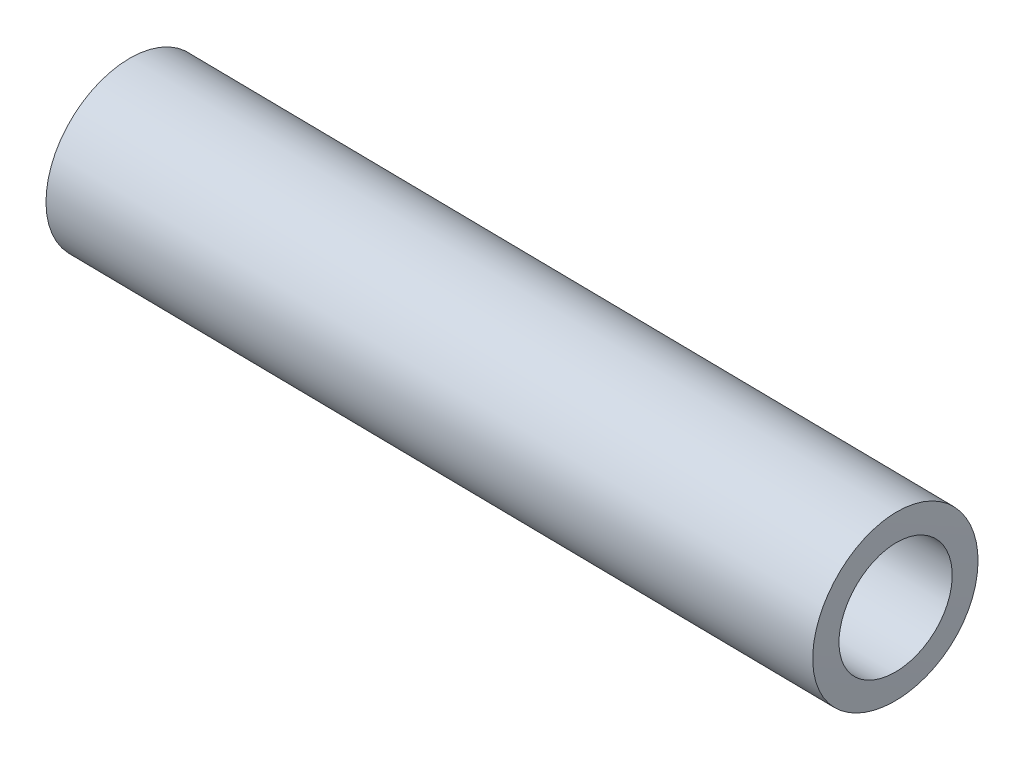
ISO-10303-21;
HEADER;
FILE_DESCRIPTION(('STEP AP214'),'2;1');
FILE_NAME('part.step','',(''),(''),'','','');
FILE_SCHEMA(('AUTOMOTIVE_DESIGN { 1 0 10303 214 1 1 1 1 }'));
ENDSEC;
DATA;
#1=APPLICATION_CONTEXT('core data for automotive mechanical design processes');
#2=APPLICATION_PROTOCOL_DEFINITION('international standard','automotive_design',2000,#1);
#3=PRODUCT_CONTEXT('',#1,'mechanical');
#4=PRODUCT('Part','Part','',(#3));
#5=PRODUCT_RELATED_PRODUCT_CATEGORY('part','',(#4));
#6=PRODUCT_DEFINITION_FORMATION('','',#4);
#7=PRODUCT_DEFINITION_CONTEXT('part definition',#1,'design');
#8=PRODUCT_DEFINITION('design','',#6,#7);
#9=PRODUCT_DEFINITION_SHAPE('','',#8);
#10=(LENGTH_UNIT() NAMED_UNIT(*) SI_UNIT(.MILLI.,.METRE.));
#11=(NAMED_UNIT(*) PLANE_ANGLE_UNIT() SI_UNIT($,.RADIAN.));
#12=(NAMED_UNIT(*) SI_UNIT($,.STERADIAN.) SOLID_ANGLE_UNIT());
#13=UNCERTAINTY_MEASURE_WITH_UNIT(LENGTH_MEASURE(1.E-05),#10,'distance_accuracy_value','');
#14=(GEOMETRIC_REPRESENTATION_CONTEXT(3) GLOBAL_UNCERTAINTY_ASSIGNED_CONTEXT((#13)) GLOBAL_UNIT_ASSIGNED_CONTEXT((#10,
#11,#12)) REPRESENTATION_CONTEXT('',''));
#15=CARTESIAN_POINT('',(0.,0.,0.));
#16=DIRECTION('',(0.,0.,1.));
#17=DIRECTION('',(1.,0.,0.));
#18=AXIS2_PLACEMENT_3D('',#15,#16,#17);
#19=CARTESIAN_POINT('',(0.,0.,0.));
#20=DIRECTION('',(0.999904802462717,-0.0137980437741954,0.));
#21=DIRECTION('',(0.0137980437741954,0.999904802462717,0.));
#22=AXIS2_PLACEMENT_3D('',#19,#20,#21);
#23=PLANE('',#22);
#24=CARTESIAN_POINT('',(0.,0.,0.));
#25=DIRECTION('',(0.999904802462717,-0.0137980437741954,0.));
#26=DIRECTION('',(0.0137980437741954,0.999904802462717,0.));
#27=AXIS2_PLACEMENT_3D('',#24,#25,#26);
#28=CIRCLE('',#27,2.175);
#29=CARTESIAN_POINT('',(0.0300107452088749,2.17479294535641,0.));
#30=VERTEX_POINT('',#29);
#31=EDGE_CURVE('E45',#30,#30,#28,.T.);
#32=ORIENTED_EDGE('',*,*,#31,.T.);
#33=EDGE_LOOP('',(#32));
#34=FACE_BOUND('',#33,.T.);
#35=CARTESIAN_POINT('',(0.,0.,0.));
#36=DIRECTION('',(0.999904802462717,-0.0137980437741954,0.));
#37=DIRECTION('',(0.0137980437741954,0.999904802462717,0.));
#38=AXIS2_PLACEMENT_3D('',#35,#36,#37);
#39=CIRCLE('',#38,3.175);
#40=CARTESIAN_POINT('',(0.0438087889830703,3.17469774781913,0.));
#41=VERTEX_POINT('',#40);
#42=EDGE_CURVE('E11',#41,#41,#39,.T.);
#43=ORIENTED_EDGE('',*,*,#42,.F.);
#44=EDGE_LOOP('',(#43));
#45=FACE_BOUND('',#44,.T.);
#46=ADVANCED_FACE('F39',(#34,#45),#23,.F.);
#47=CARTESIAN_POINT('',(0.,0.,0.));
#48=DIRECTION('',(0.999904802462717,-0.0137980437741953,0.));
#49=DIRECTION('',(0.0137980437741953,0.999904802462717,0.));
#50=AXIS2_PLACEMENT_3D('',#47,#48,#49);
#51=CYLINDRICAL_SURFACE('',#50,3.175);
#52=ORIENTED_EDGE('',*,*,#42,.T.);
#53=EDGE_LOOP('',(#52));
#54=FACE_BOUND('',#53,.T.);
#55=CARTESIAN_POINT('',(29.3785921963728,-3.5807079757313,0.));
#56=CARTESIAN_POINT('',(29.3752590480493,-3.5806541653769,0.178212508493683));
#57=CARTESIAN_POINT('',(29.3724845661729,-3.5655677856422,0.356558065686487));
#58=CARTESIAN_POINT('',(29.3683887993147,-3.50568321701444,0.708355102797621));
#59=CARTESIAN_POINT('',(29.3670692223117,-3.46085020584552,0.881800598168999));
#60=CARTESIAN_POINT('',(29.3660887109908,-3.34274287958135,1.21865930768428));
#61=CARTESIAN_POINT('',(29.3664270482651,-3.26948106775759,1.38207689566006));
#62=CARTESIAN_POINT('',(29.3688082859725,-3.09661416907263,1.69425732874237));
#63=CARTESIAN_POINT('',(29.3708507711606,-2.99701550367882,1.84302373399065));
#64=CARTESIAN_POINT('',(29.376524253009,-2.77432963855038,2.12168899112097));
#65=CARTESIAN_POINT('',(29.3801547941635,-2.6512491798576,2.25159323905932));
#66=CARTESIAN_POINT('',(29.3887383169265,-2.3850686278448,2.48890884426197));
#67=CARTESIAN_POINT('',(29.3936913538519,-2.24196769723202,2.59631926032374));
#68=CARTESIAN_POINT('',(29.4045309193483,-1.93972912910915,2.78565170799855));
#69=CARTESIAN_POINT('',(29.4104179069899,-1.78058361920398,2.86756114599454));
#70=CARTESIAN_POINT('',(29.4226457110972,-1.4508182903012,3.0035055475599));
#71=CARTESIAN_POINT('',(29.4289865291313,-1.28019843164891,3.0575404147908));
#72=CARTESIAN_POINT('',(29.4416118421916,-0.932167833560261,3.13623885405601));
#73=CARTESIAN_POINT('',(29.4478962881096,-0.754751771430641,3.16087889815372));
#74=CARTESIAN_POINT('',(29.4599020105504,-0.398282709157667,3.18000618199061));
#75=CARTESIAN_POINT('',(29.4656232887192,-0.219229713800028,3.17449350985573));
#76=CARTESIAN_POINT('',(29.4760653562866,0.135407346462868,3.13346811979988));
#77=CARTESIAN_POINT('',(29.4807863049548,0.310991959551009,3.09796018213402));
#78=CARTESIAN_POINT('',(29.4889008645109,0.653733113931407,2.99795243852028));
#79=CARTESIAN_POINT('',(29.4922944819223,0.8208896966412,2.93345277506072));
#80=CARTESIAN_POINT('',(29.4975638620792,1.14188044062916,2.7773608845751));
#81=CARTESIAN_POINT('',(29.4994409385308,1.29572602918502,2.68579220027026));
#82=CARTESIAN_POINT('',(29.5016495747917,1.5858873330509,2.47814360887074));
#83=CARTESIAN_POINT('',(29.5019811374282,1.72220308042833,2.36206374661546));
#84=CARTESIAN_POINT('',(29.5012199667841,1.97340894602012,2.10872043116794));
#85=CARTESIAN_POINT('',(29.5001275489637,2.08830380324814,1.97146167576144));
#86=CARTESIAN_POINT('',(29.4967753385494,2.29345294958376,1.67963561025278));
#87=CARTESIAN_POINT('',(29.4945155396551,2.3837071056987,1.52506820673742));
#88=CARTESIAN_POINT('',(29.4891853894652,2.53708078288938,1.20287785839574));
#89=CARTESIAN_POINT('',(29.4861144163864,2.60017939065132,1.03524496836199));
#90=CARTESIAN_POINT('',(29.4795818220167,2.69735217351047,0.691774718601178));
#91=CARTESIAN_POINT('',(29.4761201992581,2.73142623954609,0.515937328047792));
#92=CARTESIAN_POINT('',(29.4692338711295,2.76958835557505,0.160936537255392));
#93=CARTESIAN_POINT('',(29.4658091875864,2.77365955301386,-0.0182286755855951));
#94=CARTESIAN_POINT('',(29.4593899766723,2.75164509027163,-0.374704685658184));
#95=CARTESIAN_POINT('',(29.4563954477476,2.7255595390196,-0.55201548958575));
#96=CARTESIAN_POINT('',(29.4511458195568,2.64398387858084,-0.899652802161454));
#97=CARTESIAN_POINT('',(29.4488903347784,2.5885091395112,-1.06998291149226));
#98=CARTESIAN_POINT('',(29.4453067776066,2.44973467080098,-1.3989135658282));
#99=CARTESIAN_POINT('',(29.4439787000961,2.36643509469434,-1.55751417554936));
#100=CARTESIAN_POINT('',(29.4423034786049,2.17445572059152,-1.85835599514252));
#101=CARTESIAN_POINT('',(29.4419555584009,2.06579608007489,-2.00061006475905));
#102=CARTESIAN_POINT('',(29.4421510261388,1.8261494560991,-2.26486935634854));
#103=CARTESIAN_POINT('',(29.442694415578,1.69516243513384,-2.38687454430622));
#104=CARTESIAN_POINT('',(29.4444588496681,1.41455778058497,-2.60720143542545));
#105=CARTESIAN_POINT('',(29.4456800134251,1.2649368760289,-2.70551897156737));
#106=CARTESIAN_POINT('',(29.4484884094659,0.951326951650522,-2.87566501285506));
#107=CARTESIAN_POINT('',(29.450075643538,0.78733786163841,-2.9474933885901));
#108=CARTESIAN_POINT('',(29.4532483342847,0.449489401271856,-3.06268240461309));
#109=CARTESIAN_POINT('',(29.4548337882182,0.275621581846951,-3.10601826521746));
#110=CARTESIAN_POINT('',(29.4576206337842,-0.0769248268427774,-3.16289372693102));
#111=CARTESIAN_POINT('',(29.4588220242146,-0.255603431164911,-3.17643323476941));
#112=CARTESIAN_POINT('',(29.4604977219128,-0.612738977395154,-3.17332606736118));
#113=CARTESIAN_POINT('',(29.4609718800864,-0.791195866356886,-3.15667320372464));
#114=CARTESIAN_POINT('',(29.4609314629082,-1.1427787163772,-3.09363434150447));
#115=CARTESIAN_POINT('',(29.4604168909468,-1.3159046957141,-3.04724844487972));
#116=CARTESIAN_POINT('',(29.4582563442031,-1.65177104539978,-2.92610304109604));
#117=CARTESIAN_POINT('',(29.4566112278417,-1.81451919323355,-2.85136508089427));
#118=CARTESIAN_POINT('',(29.4521867181082,-2.12513999867619,-2.67563777248148));
#119=CARTESIAN_POINT('',(29.4494073724954,-2.27301328229582,-2.5746495296589));
#120=CARTESIAN_POINT('',(29.4428578088769,-2.54960179314022,-2.34936766015685));
#121=CARTESIAN_POINT('',(29.439088236391,-2.67832941593397,-2.22508923120465));
#122=CARTESIAN_POINT('',(29.4308307575864,-2.91312884107981,-1.95667303372886));
#123=CARTESIAN_POINT('',(29.4263426738715,-3.01919503332305,-1.8125303620688));
#124=CARTESIAN_POINT('',(29.4170261263272,-3.20572786666503,-1.5083658043606));
#125=CARTESIAN_POINT('',(29.4121973254625,-3.28616871310809,-1.34832812946173));
#126=CARTESIAN_POINT('',(29.4026575488194,-3.41896509456258,-1.01714372832326));
#127=CARTESIAN_POINT('',(29.3979464413136,-3.47135350559268,-0.846010270751458));
#128=CARTESIAN_POINT('',(29.3907317235721,-3.5328643557611,-0.561519313805369));
#129=CARTESIAN_POINT('',(29.3880522768198,-3.55080841735575,-0.449995928430688));
#130=CARTESIAN_POINT('',(29.383037933621,-3.57474727260559,-0.225666149504658));
#131=CARTESIAN_POINT('',(29.3807030375524,-3.58074205315629,-0.1128597545464));
#132=CARTESIAN_POINT('',(29.3785921963728,-3.5807079757313,0.));
#133=B_SPLINE_CURVE_WITH_KNOTS('',3,(#55,#56,#57,#58,#59,#60,#61,#62,#63,#64,#65,#66,#67,#68,
#69,#70,#71,#72,#73,#74,#75,#76,#77,#78,#79,#80,#81,#82,#83,#84,#85,#86,#87,#88,#89,#90,#91,#92,
#93,#94,#95,#96,#97,#98,#99,#100,#101,#102,#103,#104,#105,#106,#107,#108,#109,#110,#111,#112,
#113,#114,#115,#116,#117,#118,#119,#120,#121,#122,#123,#124,#125,#126,#127,#128,#129,#130,#131,
#132),.UNSPECIFIED.,.T.,.F.,(4,2,2,2,2,2,2,2,2,2,2,2,2,2,2,2,2,2,2,2,2,2,2,2,2,2,2,2,2,2,2,2,2,
2,2,2,2,2,4),(0.,0.534319751264771,1.06926609902135,1.60397743818695,2.13855852373435,
2.67298637457333,3.20743658284771,3.74215031135705,4.2768658879006,4.81200917007237,
5.34715088820659,5.88220733850277,6.41726115913596,6.95185099006359,7.48643984305019,
8.02091028648869,8.55538361455448,9.09026782340098,9.62515404210062,10.1603406824943,
10.6955253897498,11.2304304791058,11.7653326169716,12.299811026528,12.8342903339236,
13.3688635958509,13.9034394693594,14.4384796458659,14.9735214971932,15.5086730259573,
16.0438227196194,16.5785665231841,17.1132878125571,17.6476613834166,18.1821670919672,
18.7172091499975,19.2516227860834,19.5900004361923,19.9283784573915),.UNSPECIFIED.);
#134=CARTESIAN_POINT('',(29.3785921963728,-3.5807079757313,0.));
#135=VERTEX_POINT('',#134);
#136=EDGE_CURVE('E53',#135,#135,#133,.T.);
#137=ORIENTED_EDGE('',*,*,#136,.T.);
#138=EDGE_LOOP('',(#137));
#139=FACE_BOUND('',#138,.T.);
#140=ADVANCED_FACE('F74',(#54,#139),#51,.T.);
#141=CARTESIAN_POINT('',(0.,0.,0.));
#142=DIRECTION('',(0.999904802462717,-0.0137980437741953,0.));
#143=DIRECTION('',(0.0137980437741953,0.999904802462717,0.));
#144=AXIS2_PLACEMENT_3D('',#141,#142,#143);
#145=CYLINDRICAL_SURFACE('',#144,2.175);
#146=ORIENTED_EDGE('',*,*,#31,.F.);
#147=EDGE_LOOP('',(#146));
#148=FACE_BOUND('',#147,.T.);
#149=CARTESIAN_POINT('',(29.4208274621546,-2.58119558865964,0.));
#150=CARTESIAN_POINT('',(29.419263329916,-2.58116861647864,0.122129360231471));
#151=CARTESIAN_POINT('',(29.418006391571,-2.57083469936935,0.244348506529332));
#152=CARTESIAN_POINT('',(29.416263430287,-2.52979669121451,0.485426495211247));
#153=CARTESIAN_POINT('',(29.4157783261439,-2.49906838411098,0.604281167520492));
#154=CARTESIAN_POINT('',(29.415671530385,-2.41811484173385,0.835105712912034));
#155=CARTESIAN_POINT('',(29.416049442153,-2.36789857134687,0.947078724311936));
#156=CARTESIAN_POINT('',(29.4176838201298,-2.24940737879853,1.16097651329309));
#157=CARTESIAN_POINT('',(29.4189400700245,-2.18113690553483,1.2629037578594));
#158=CARTESIAN_POINT('',(29.4222684845585,-2.02847665832366,1.45384465334013));
#159=CARTESIAN_POINT('',(29.4243405848559,-1.94408815579034,1.54285932184395));
#160=CARTESIAN_POINT('',(29.4291654154392,-1.76157946614712,1.70546258066839));
#161=CARTESIAN_POINT('',(29.4319181732677,-1.6634587234355,1.77905054652884));
#162=CARTESIAN_POINT('',(29.4379088810119,-1.45624730544814,1.90872582744952));
#163=CARTESIAN_POINT('',(29.441146938336,-1.34715420348603,1.96480925984094));
#164=CARTESIAN_POINT('',(29.4478698661671,-1.12110797443002,2.05786471678806));
#165=CARTESIAN_POINT('',(29.451354736811,-1.00415484297389,2.09483673073702));
#166=CARTESIAN_POINT('',(29.4583161238711,-0.765656183801529,2.14863183639577));
#167=CARTESIAN_POINT('',(29.4617926366531,-0.644108945748158,2.16544734629922));
#168=CARTESIAN_POINT('',(29.4684856157513,-0.399909828331075,2.17842567493382));
#169=CARTESIAN_POINT('',(29.4717020826741,-0.27725795154498,2.17458854184438));
#170=CARTESIAN_POINT('',(29.4776549312101,-0.0343380817565879,2.14636936715249));
#171=CARTESIAN_POINT('',(29.4803913488938,0.085930089752466,2.12198886996083));
#172=CARTESIAN_POINT('',(29.4852158533804,0.320677097129612,2.05337511513746));
#173=CARTESIAN_POINT('',(29.4873039413146,0.435155943099679,2.00914189214872));
#174=CARTESIAN_POINT('',(29.4907288729423,0.655026679457501,1.90210035177872));
#175=CARTESIAN_POINT('',(29.4920660223103,0.7604222524417,1.83929960834546));
#176=CARTESIAN_POINT('',(29.4939623067928,0.959185922382892,1.69689995139603));
#177=CARTESIAN_POINT('',(29.4945214427399,1.052554032211,1.61730105585655));
#178=CARTESIAN_POINT('',(29.4949072908668,1.22460375863754,1.4435750424449));
#179=CARTESIAN_POINT('',(29.4947340786198,1.30328688974783,1.34944942459434));
#180=CARTESIAN_POINT('',(29.4937664101551,1.44374751932507,1.14933507669506));
#181=CARTESIAN_POINT('',(29.4929719523139,1.50552497360974,1.04334631564351));
#182=CARTESIAN_POINT('',(29.4909226946925,1.61044182655082,0.822470961713802));
#183=CARTESIAN_POINT('',(29.4896677286218,1.65357448026473,0.707581166492262));
#184=CARTESIAN_POINT('',(29.4868890550951,1.71994487230262,0.472194957616573));
#185=CARTESIAN_POINT('',(29.4853653471747,1.74318257624716,0.351698534274278));
#186=CARTESIAN_POINT('',(29.4822475051574,1.7691045154953,0.108483383859914));
#187=CARTESIAN_POINT('',(29.4806533526725,1.77178335211571,-0.0142359184525241));
#188=CARTESIAN_POINT('',(29.4775779093176,1.75649322422271,-0.258382907182172));
#189=CARTESIAN_POINT('',(29.4760966182587,1.73852429426736,-0.379810595760807));
#190=CARTESIAN_POINT('',(29.4733934432991,1.68245212416609,-0.617896213384861));
#191=CARTESIAN_POINT('',(29.4721714956118,1.64435384298492,-0.734555309573831));
#192=CARTESIAN_POINT('',(29.4700800443416,1.54910575576803,-0.959821163899725));
#193=CARTESIAN_POINT('',(29.4692105398238,1.49195600027099,-1.06842794339645));
#194=CARTESIAN_POINT('',(29.4678557561292,1.36025300169734,-1.27446521720704));
#195=CARTESIAN_POINT('',(29.4673703345007,1.28570622426864,-1.37189984366586));
#196=CARTESIAN_POINT('',(29.4667511071614,1.1213153390478,-1.55287468198949));
#197=CARTESIAN_POINT('',(29.4666173018058,1.03147121580152,-1.6364148798173));
#198=CARTESIAN_POINT('',(29.466611804388,0.839029366648095,-1.7872387260589));
#199=CARTESIAN_POINT('',(29.4667401343195,0.736430571273636,-1.85452100986757));
#200=CARTESIAN_POINT('',(29.4671250952322,0.521397471248758,-1.97091420264993));
#201=CARTESIAN_POINT('',(29.4673817264361,0.408963149519121,-2.02002508006853));
#202=CARTESIAN_POINT('',(29.4678637060205,0.177400708118689,-2.09870071532003));
#203=CARTESIAN_POINT('',(29.4680890416193,0.0582698812594484,-2.12825750548319));
#204=CARTESIAN_POINT('',(29.4683442806663,-0.183263377592409,-2.16695437809847));
#205=CARTESIAN_POINT('',(29.4683741836429,-0.305665817476973,-2.17609441129577));
#206=CARTESIAN_POINT('',(29.4680927479636,-0.550279356319009,-2.17369644436903));
#207=CARTESIAN_POINT('',(29.4677813773457,-0.672490436281035,-2.16215650739103));
#208=CARTESIAN_POINT('',(29.4667102066067,-0.913238016339718,-2.11871994289242));
#209=CARTESIAN_POINT('',(29.4659504067295,-1.03177451843612,-2.08682332645036));
#210=CARTESIAN_POINT('',(29.4639304349347,-1.26176358861767,-2.00359229926751));
#211=CARTESIAN_POINT('',(29.4626704366829,-1.37321859978883,-1.95226463515244));
#212=CARTESIAN_POINT('',(29.4596624740903,-1.5859190774607,-1.83162986953853));
#213=CARTESIAN_POINT('',(29.4579145295575,-1.6871649581686,-1.76232349788387));
#214=CARTESIAN_POINT('',(29.4540105887287,-1.87654345648144,-1.60772852681453));
#215=CARTESIAN_POINT('',(29.4518547393782,-1.96468077601433,-1.52244568294517));
#216=CARTESIAN_POINT('',(29.4472742327275,-2.1254086299205,-1.33827508089912));
#217=CARTESIAN_POINT('',(29.4448495089036,-2.19799530374412,-1.23938395436116));
#218=CARTESIAN_POINT('',(29.4399187608077,-2.32558383507296,-1.03075870396518));
#219=CARTESIAN_POINT('',(29.4374126787868,-2.38057288710306,-0.921016759827311));
#220=CARTESIAN_POINT('',(29.4325414982595,-2.47128882988887,-0.69394252147406));
#221=CARTESIAN_POINT('',(29.4301762355818,-2.50703855763986,-0.576619412264275));
#222=CARTESIAN_POINT('',(29.4266213530054,-2.54882032042265,-0.38213357855682));
#223=CARTESIAN_POINT('',(29.4253212533618,-2.5609576862308,-0.306230064957062));
#224=CARTESIAN_POINT('',(29.422916098245,-2.57715380300142,-0.153562869336355));
#225=CARTESIAN_POINT('',(29.4218110428746,-2.58121254970459,-0.0767991868619167));
#226=CARTESIAN_POINT('',(29.4208274621546,-2.58119558865964,0.));
#227=B_SPLINE_CURVE_WITH_KNOTS('',3,(#149,#150,#151,#152,#153,#154,#155,#156,#157,#158,#159,
#160,#161,#162,#163,#164,#165,#166,#167,#168,#169,#170,#171,#172,#173,#174,#175,#176,#177,#178,
#179,#180,#181,#182,#183,#184,#185,#186,#187,#188,#189,#190,#191,#192,#193,#194,#195,#196,#197,
#198,#199,#200,#201,#202,#203,#204,#205,#206,#207,#208,#209,#210,#211,#212,#213,#214,#215,#216,
#217,#218,#219,#220,#221,#222,#223,#224,#225,#226),.UNSPECIFIED.,.T.,.F.,(4,2,2,2,2,2,2,2,2,2,2,
2,2,2,2,2,2,2,2,2,2,2,2,2,2,2,2,2,2,2,2,2,2,2,2,2,2,2,4),(0.,0.366138022580956,
0.732711572776014,1.09911669068266,1.46543160342279,1.8317176326223,2.19801848591584,
2.56440053050992,2.93078277844405,3.29730279671925,3.66382195996044,4.03031357145081,
4.39680454341638,4.76314622442779,5.12948751339766,5.49579099943943,5.8620954427911,
6.22853228975237,6.59496976993295,6.96150347196106,7.32803656052452,7.69447939393153,
8.06092125526717,8.42722714382207,8.79353340243974,9.15987039623676,9.52620802618416,
9.89269483529896,10.2591825285511,10.6257045482667,10.9922263685131,11.3586210457973,
11.725000851646,12.0912489216212,12.4575878099857,12.8241926736317,13.1903614136713,
13.4206016076334,13.6508419229855),.UNSPECIFIED.);
#228=CARTESIAN_POINT('',(29.4208274621546,-2.58119558865964,0.));
#229=VERTEX_POINT('',#228);
#230=EDGE_CURVE('E49',#229,#229,#227,.T.);
#231=ORIENTED_EDGE('',*,*,#230,.F.);
#232=EDGE_LOOP('',(#231));
#233=FACE_BOUND('',#232,.T.);
#234=ADVANCED_FACE('F70',(#148,#233),#145,.F.);
#235=CARTESIAN_POINT('',(-41.9032263783233,45.0775880198027,80.2953988589175));
#236=DIRECTION('',(0.0066878890988712,0.484652211409795,0.874681374052858));
#237=DIRECTION('',(-0.012068891887685,-0.874598106540141,0.484698353499373));
#238=AXIS2_PLACEMENT_3D('',#235,#236,#237);
#239=CYLINDRICAL_SURFACE('',#238,72.);
#240=ORIENTED_EDGE('',*,*,#230,.T.);
#241=EDGE_LOOP('',(#240));
#242=FACE_BOUND('',#241,.T.);
#243=ORIENTED_EDGE('',*,*,#136,.F.);
#244=EDGE_LOOP('',(#243));
#245=FACE_BOUND('',#244,.T.);
#246=ADVANCED_FACE('F66',(#242,#245),#239,.T.);
#247=CLOSED_SHELL('',(#46,#140,#234,#246));
#248=MANIFOLD_SOLID_BREP('B2',#247);
#249=ADVANCED_BREP_SHAPE_REPRESENTATION('',(#18,#248),#14);
#250=SHAPE_DEFINITION_REPRESENTATION(#9,#249);
ENDSEC;
END-ISO-10303-21;
